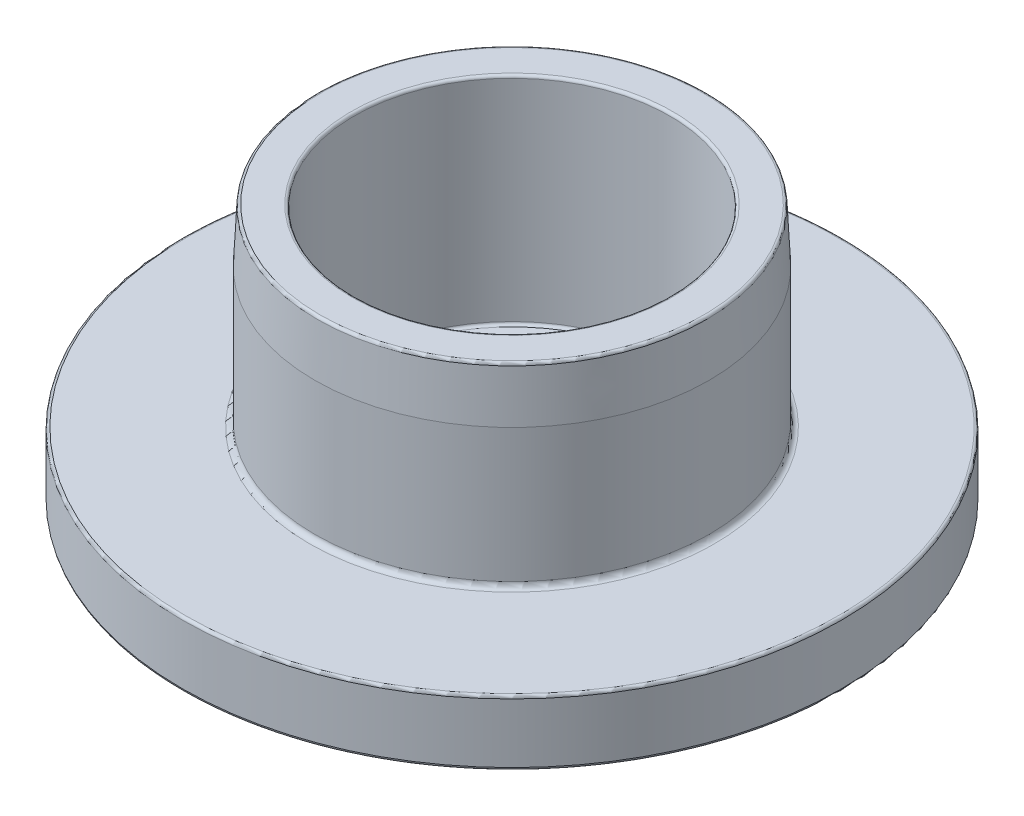
ISO-10303-21;
HEADER;
FILE_DESCRIPTION(('STEP AP214'),'2;1');
FILE_NAME('part.step','',(''),(''),'','','');
FILE_SCHEMA(('AUTOMOTIVE_DESIGN { 1 0 10303 214 1 1 1 1 }'));
ENDSEC;
DATA;
#1=APPLICATION_CONTEXT('core data for automotive mechanical design processes');
#2=APPLICATION_PROTOCOL_DEFINITION('international standard','automotive_design',2000,#1);
#3=PRODUCT_CONTEXT('',#1,'mechanical');
#4=PRODUCT('Part','Part','',(#3));
#5=PRODUCT_RELATED_PRODUCT_CATEGORY('part','',(#4));
#6=PRODUCT_DEFINITION_FORMATION('','',#4);
#7=PRODUCT_DEFINITION_CONTEXT('part definition',#1,'design');
#8=PRODUCT_DEFINITION('design','',#6,#7);
#9=PRODUCT_DEFINITION_SHAPE('','',#8);
#10=(LENGTH_UNIT() NAMED_UNIT(*) SI_UNIT(.MILLI.,.METRE.));
#11=(NAMED_UNIT(*) PLANE_ANGLE_UNIT() SI_UNIT($,.RADIAN.));
#12=(NAMED_UNIT(*) SI_UNIT($,.STERADIAN.) SOLID_ANGLE_UNIT());
#13=UNCERTAINTY_MEASURE_WITH_UNIT(LENGTH_MEASURE(1.E-05),#10,'distance_accuracy_value','');
#14=(GEOMETRIC_REPRESENTATION_CONTEXT(3) GLOBAL_UNCERTAINTY_ASSIGNED_CONTEXT((#13)) GLOBAL_UNIT_ASSIGNED_CONTEXT((#10,
#11,#12)) REPRESENTATION_CONTEXT('',''));
#15=CARTESIAN_POINT('',(0.,0.,0.));
#16=DIRECTION('',(0.,0.,1.));
#17=DIRECTION('',(1.,0.,0.));
#18=AXIS2_PLACEMENT_3D('',#15,#16,#17);
#19=CARTESIAN_POINT('',(0.,-52.5162162162162,0.));
#20=DIRECTION('',(0.,-1.,0.));
#21=DIRECTION('',(0.,0.,-1.));
#22=AXIS2_PLACEMENT_3D('',#19,#20,#21);
#23=CYLINDRICAL_SURFACE('',#22,29.25);
#24=CARTESIAN_POINT('',(0.,10.4228228228228,0.));
#25=DIRECTION('',(0.,1.,0.));
#26=DIRECTION('',(0.,0.,1.));
#27=AXIS2_PLACEMENT_3D('',#24,#25,#26);
#28=CIRCLE('',#27,29.25);
#29=CARTESIAN_POINT('',(0.,10.4228228228228,29.25));
#30=VERTEX_POINT('',#29);
#31=EDGE_CURVE('E61',#30,#30,#28,.F.);
#32=ORIENTED_EDGE('',*,*,#31,.T.);
#33=EDGE_LOOP('',(#32));
#34=FACE_BOUND('',#33,.T.);
#35=CARTESIAN_POINT('',(0.,49.4228228228228,0.));
#36=DIRECTION('',(0.,1.,0.));
#37=DIRECTION('',(0.,0.,1.));
#38=AXIS2_PLACEMENT_3D('',#35,#36,#37);
#39=CIRCLE('',#38,29.25);
#40=CARTESIAN_POINT('',(0.,49.4228228228228,29.25));
#41=VERTEX_POINT('',#40);
#42=EDGE_CURVE('E79',#41,#41,#39,.T.);
#43=ORIENTED_EDGE('',*,*,#42,.T.);
#44=EDGE_LOOP('',(#43));
#45=FACE_BOUND('',#44,.T.);
#46=ADVANCED_FACE('F29',(#34,#45),#23,.F.);
#47=CARTESIAN_POINT('',(29.25,49.9228228228228,0.));
#48=DIRECTION('',(0.,1.,0.));
#49=DIRECTION('',(0.,0.,1.));
#50=AXIS2_PLACEMENT_3D('',#47,#48,#49);
#51=PLANE('',#50);
#52=CARTESIAN_POINT('',(0.,49.9228228228228,0.));
#53=DIRECTION('',(0.,1.,0.));
#54=DIRECTION('',(0.,0.,1.));
#55=AXIS2_PLACEMENT_3D('',#52,#53,#54);
#56=CIRCLE('',#55,29.75);
#57=CARTESIAN_POINT('',(0.,49.9228228228228,29.75));
#58=VERTEX_POINT('',#57);
#59=EDGE_CURVE('E82',#58,#58,#56,.F.);
#60=ORIENTED_EDGE('',*,*,#59,.T.);
#61=EDGE_LOOP('',(#60));
#62=FACE_BOUND('',#61,.T.);
#63=CARTESIAN_POINT('',(0.,49.9228228228228,0.));
#64=DIRECTION('',(0.,1.,0.));
#65=DIRECTION('',(0.,0.,1.));
#66=AXIS2_PLACEMENT_3D('',#63,#64,#65);
#67=CIRCLE('',#66,35.5243753901375);
#68=CARTESIAN_POINT('',(0.,49.9228228228228,35.5243753901375));
#69=VERTEX_POINT('',#68);
#70=EDGE_CURVE('E85',#69,#69,#67,.T.);
#71=ORIENTED_EDGE('',*,*,#70,.T.);
#72=EDGE_LOOP('',(#71));
#73=FACE_BOUND('',#72,.T.);
#74=ADVANCED_FACE('F125',(#62,#73),#51,.T.);
#75=CARTESIAN_POINT('',(0.,39.9228228228228,0.));
#76=DIRECTION('',(0.,-1.,0.));
#77=DIRECTION('',(0.,0.,-1.));
#78=AXIS2_PLACEMENT_3D('',#75,#76,#77);
#79=CONICAL_SURFACE('',#78,36.5,0.0499583957219407);
#80=CARTESIAN_POINT('',(0.,49.4477916312948,0.));
#81=DIRECTION('',(0.,1.,0.));
#82=DIRECTION('',(0.,0.,1.));
#83=AXIS2_PLACEMENT_3D('',#80,#81,#82);
#84=CIRCLE('',#83,36.0237515595764);
#85=CARTESIAN_POINT('',(0.,49.4477916312948,36.0237515595764));
#86=VERTEX_POINT('',#85);
#87=EDGE_CURVE('E76',#86,#86,#84,.F.);
#88=ORIENTED_EDGE('',*,*,#87,.T.);
#89=EDGE_LOOP('',(#88));
#90=FACE_BOUND('',#89,.T.);
#91=CARTESIAN_POINT('',(0.,39.9228228228228,0.));
#92=DIRECTION('',(0.,-1.,0.));
#93=DIRECTION('',(0.,0.,-1.));
#94=AXIS2_PLACEMENT_3D('',#91,#92,#93);
#95=CIRCLE('',#94,36.5);
#96=CARTESIAN_POINT('',(0.,39.9228228228228,-36.5));
#97=VERTEX_POINT('',#96);
#98=EDGE_CURVE('E100',#97,#97,#95,.T.);
#99=ORIENTED_EDGE('',*,*,#98,.F.);
#100=EDGE_LOOP('',(#99));
#101=FACE_BOUND('',#100,.T.);
#102=ADVANCED_FACE('F131',(#90,#101),#79,.T.);
#103=CARTESIAN_POINT('',(0.,-52.5162162162162,0.));
#104=DIRECTION('',(0.,-1.,0.));
#105=DIRECTION('',(0.,0.,-1.));
#106=AXIS2_PLACEMENT_3D('',#103,#104,#105);
#107=CYLINDRICAL_SURFACE('',#106,36.5);
#108=CARTESIAN_POINT('',(0.,15.2228228228228,0.));
#109=DIRECTION('',(0.,1.,0.));
#110=DIRECTION('',(0.,0.,1.));
#111=AXIS2_PLACEMENT_3D('',#108,#109,#110);
#112=CIRCLE('',#111,36.5);
#113=CARTESIAN_POINT('',(0.,15.2228228228228,36.5));
#114=VERTEX_POINT('',#113);
#115=EDGE_CURVE('E70',#114,#114,#112,.T.);
#116=ORIENTED_EDGE('',*,*,#115,.T.);
#117=EDGE_LOOP('',(#116));
#118=FACE_BOUND('',#117,.T.);
#119=ORIENTED_EDGE('',*,*,#98,.T.);
#120=EDGE_LOOP('',(#119));
#121=FACE_BOUND('',#120,.T.);
#122=ADVANCED_FACE('F310',(#118,#121),#107,.T.);
#123=CARTESIAN_POINT('',(36.5,14.2228228228228,0.));
#124=DIRECTION('',(0.,1.,0.));
#125=DIRECTION('',(0.,0.,1.));
#126=AXIS2_PLACEMENT_3D('',#123,#124,#125);
#127=PLANE('',#126);
#128=CARTESIAN_POINT('',(0.,14.2228228228228,0.));
#129=DIRECTION('',(0.,1.,0.));
#130=DIRECTION('',(0.,0.,1.));
#131=AXIS2_PLACEMENT_3D('',#128,#129,#130);
#132=CIRCLE('',#131,37.5);
#133=CARTESIAN_POINT('',(0.,14.2228228228228,37.5));
#134=VERTEX_POINT('',#133);
#135=EDGE_CURVE('E73',#134,#134,#132,.F.);
#136=ORIENTED_EDGE('',*,*,#135,.T.);
#137=EDGE_LOOP('',(#136));
#138=FACE_BOUND('',#137,.T.);
#139=CARTESIAN_POINT('',(0.,14.2228228228228,0.));
#140=DIRECTION('',(0.,1.,0.));
#141=DIRECTION('',(0.,0.,1.));
#142=AXIS2_PLACEMENT_3D('',#139,#140,#141);
#143=CIRCLE('',#142,60.5);
#144=CARTESIAN_POINT('',(0.,14.2228228228228,60.5));
#145=VERTEX_POINT('',#144);
#146=EDGE_CURVE('E88',#145,#145,#143,.T.);
#147=ORIENTED_EDGE('',*,*,#146,.T.);
#148=EDGE_LOOP('',(#147));
#149=FACE_BOUND('',#148,.T.);
#150=ADVANCED_FACE('F303',(#138,#149),#127,.T.);
#151=CARTESIAN_POINT('',(0.,-52.5162162162162,0.));
#152=DIRECTION('',(0.,-1.,0.));
#153=DIRECTION('',(0.,0.,-1.));
#154=AXIS2_PLACEMENT_3D('',#151,#152,#153);
#155=CYLINDRICAL_SURFACE('',#154,61.);
#156=CARTESIAN_POINT('',(0.,2.72282282282282,0.));
#157=DIRECTION('',(0.,-1.,0.));
#158=DIRECTION('',(0.,0.,-1.));
#159=AXIS2_PLACEMENT_3D('',#156,#157,#158);
#160=CIRCLE('',#159,61.);
#161=CARTESIAN_POINT('',(0.,2.72282282282282,-61.));
#162=VERTEX_POINT('',#161);
#163=EDGE_CURVE('E91',#162,#162,#160,.F.);
#164=ORIENTED_EDGE('',*,*,#163,.T.);
#165=EDGE_LOOP('',(#164));
#166=FACE_BOUND('',#165,.T.);
#167=CARTESIAN_POINT('',(0.,13.7228228228228,0.));
#168=DIRECTION('',(0.,1.,0.));
#169=DIRECTION('',(0.,0.,1.));
#170=AXIS2_PLACEMENT_3D('',#167,#168,#169);
#171=CIRCLE('',#170,61.);
#172=CARTESIAN_POINT('',(0.,13.7228228228228,61.));
#173=VERTEX_POINT('',#172);
#174=EDGE_CURVE('E94',#173,#173,#171,.F.);
#175=ORIENTED_EDGE('',*,*,#174,.T.);
#176=EDGE_LOOP('',(#175));
#177=FACE_BOUND('',#176,.T.);
#178=ADVANCED_FACE('F122',(#166,#177),#155,.T.);
#179=CARTESIAN_POINT('',(61.,2.22282282282282,0.));
#180=DIRECTION('',(0.,-1.,0.));
#181=DIRECTION('',(0.,0.,-1.));
#182=AXIS2_PLACEMENT_3D('',#179,#180,#181);
#183=PLANE('',#182);
#184=CARTESIAN_POINT('',(0.,2.22282282282282,0.));
#185=DIRECTION('',(0.,-1.,0.));
#186=DIRECTION('',(0.,0.,-1.));
#187=AXIS2_PLACEMENT_3D('',#184,#185,#186);
#188=CIRCLE('',#187,34.);
#189=CARTESIAN_POINT('',(0.,2.22282282282282,-34.));
#190=VERTEX_POINT('',#189);
#191=EDGE_CURVE('E10',#190,#190,#188,.F.);
#192=ORIENTED_EDGE('',*,*,#191,.T.);
#193=EDGE_LOOP('',(#192));
#194=FACE_BOUND('',#193,.T.);
#195=CARTESIAN_POINT('',(0.,2.22282282282282,0.));
#196=DIRECTION('',(0.,-1.,0.));
#197=DIRECTION('',(0.,0.,-1.));
#198=AXIS2_PLACEMENT_3D('',#195,#196,#197);
#199=CIRCLE('',#198,60.5);
#200=CARTESIAN_POINT('',(0.,2.22282282282282,-60.5));
#201=VERTEX_POINT('',#200);
#202=EDGE_CURVE('E97',#201,#201,#199,.T.);
#203=ORIENTED_EDGE('',*,*,#202,.T.);
#204=EDGE_LOOP('',(#203));
#205=FACE_BOUND('',#204,.T.);
#206=ADVANCED_FACE('F113',(#194,#205),#183,.T.);
#207=CARTESIAN_POINT('',(0.,-52.5162162162162,0.));
#208=DIRECTION('',(0.,-1.,0.));
#209=DIRECTION('',(0.,0.,-1.));
#210=AXIS2_PLACEMENT_3D('',#207,#208,#209);
#211=CYLINDRICAL_SURFACE('',#210,33.);
#212=CARTESIAN_POINT('',(0.,1.22282282282282,0.));
#213=DIRECTION('',(0.,-1.,0.));
#214=DIRECTION('',(0.,0.,-1.));
#215=AXIS2_PLACEMENT_3D('',#212,#213,#214);
#216=CIRCLE('',#215,33.);
#217=CARTESIAN_POINT('',(0.,1.22282282282282,-33.));
#218=VERTEX_POINT('',#217);
#219=EDGE_CURVE('E36',#218,#218,#216,.T.);
#220=ORIENTED_EDGE('',*,*,#219,.T.);
#221=EDGE_LOOP('',(#220));
#222=FACE_BOUND('',#221,.T.);
#223=CARTESIAN_POINT('',(0.,-5.27717717717718,0.));
#224=DIRECTION('',(0.,-1.,0.));
#225=DIRECTION('',(0.,0.,-1.));
#226=AXIS2_PLACEMENT_3D('',#223,#224,#225);
#227=CIRCLE('',#226,33.);
#228=CARTESIAN_POINT('',(0.,-5.27717717717718,-33.));
#229=VERTEX_POINT('',#228);
#230=EDGE_CURVE('E103',#229,#229,#227,.T.);
#231=ORIENTED_EDGE('',*,*,#230,.F.);
#232=EDGE_LOOP('',(#231));
#233=FACE_BOUND('',#232,.T.);
#234=ADVANCED_FACE('F110',(#222,#233),#211,.T.);
#235=CARTESIAN_POINT('',(0.,-17.7771771771772,0.));
#236=DIRECTION('',(0.,1.,0.));
#237=DIRECTION('',(0.,0.,1.));
#238=AXIS2_PLACEMENT_3D('',#235,#236,#237);
#239=CONICAL_SURFACE('',#238,30.75,0.0996686524911615);
#240=CARTESIAN_POINT('',(0.,-17.3269290366876,0.));
#241=DIRECTION('',(0.,-1.,0.));
#242=DIRECTION('',(0.,0.,-1.));
#243=AXIS2_PLACEMENT_3D('',#240,#241,#242);
#244=CIRCLE('',#243,30.7950248140489);
#245=CARTESIAN_POINT('',(0.,-17.3269290366876,-30.7950248140489));
#246=VERTEX_POINT('',#245);
#247=EDGE_CURVE('E40',#246,#246,#244,.F.);
#248=ORIENTED_EDGE('',*,*,#247,.T.);
#249=EDGE_LOOP('',(#248));
#250=FACE_BOUND('',#249,.T.);
#251=CARTESIAN_POINT('',(0.,-6.58360669539551,0.));
#252=DIRECTION('',(0.,1.,0.));
#253=DIRECTION('',(0.,0.,1.));
#254=AXIS2_PLACEMENT_3D('',#251,#252,#253);
#255=CIRCLE('',#254,31.8693570481782);
#256=CARTESIAN_POINT('',(0.,-6.58360669539551,31.8693570481782));
#257=VERTEX_POINT('',#256);
#258=EDGE_CURVE('E55',#257,#257,#255,.F.);
#259=ORIENTED_EDGE('',*,*,#258,.T.);
#260=EDGE_LOOP('',(#259));
#261=FACE_BOUND('',#260,.T.);
#262=ADVANCED_FACE('F112',(#250,#261),#239,.T.);
#263=CARTESIAN_POINT('',(30.75,-17.7771771771772,0.));
#264=DIRECTION('',(0.,-1.,0.));
#265=DIRECTION('',(0.,0.,-1.));
#266=AXIS2_PLACEMENT_3D('',#263,#264,#265);
#267=PLANE('',#266);
#268=CARTESIAN_POINT('',(0.,-17.7771771771772,0.));
#269=DIRECTION('',(0.,-1.,0.));
#270=DIRECTION('',(0.,0.,-1.));
#271=AXIS2_PLACEMENT_3D('',#268,#269,#270);
#272=CIRCLE('',#271,24.);
#273=CARTESIAN_POINT('',(0.,-17.7771771771772,-24.));
#274=VERTEX_POINT('',#273);
#275=EDGE_CURVE('E44',#274,#274,#272,.F.);
#276=ORIENTED_EDGE('',*,*,#275,.T.);
#277=EDGE_LOOP('',(#276));
#278=FACE_BOUND('',#277,.T.);
#279=CARTESIAN_POINT('',(0.,-17.7771771771772,0.));
#280=DIRECTION('',(0.,-1.,0.));
#281=DIRECTION('',(0.,0.,-1.));
#282=AXIS2_PLACEMENT_3D('',#279,#280,#281);
#283=CIRCLE('',#282,30.2975062189439);
#284=CARTESIAN_POINT('',(0.,-17.7771771771772,-30.2975062189439));
#285=VERTEX_POINT('',#284);
#286=EDGE_CURVE('E49',#285,#285,#283,.T.);
#287=ORIENTED_EDGE('',*,*,#286,.T.);
#288=EDGE_LOOP('',(#287));
#289=FACE_BOUND('',#288,.T.);
#290=ADVANCED_FACE('F119',(#278,#289),#267,.T.);
#291=CARTESIAN_POINT('',(0.,-52.5162162162162,0.));
#292=DIRECTION('',(0.,-1.,0.));
#293=DIRECTION('',(0.,0.,-1.));
#294=AXIS2_PLACEMENT_3D('',#291,#292,#293);
#295=CYLINDRICAL_SURFACE('',#294,23.5);
#296=CARTESIAN_POINT('',(0.,-17.2771771771772,0.));
#297=DIRECTION('',(0.,-1.,0.));
#298=DIRECTION('',(0.,0.,-1.));
#299=AXIS2_PLACEMENT_3D('',#296,#297,#298);
#300=CIRCLE('',#299,23.5);
#301=CARTESIAN_POINT('',(0.,-17.2771771771772,-23.5));
#302=VERTEX_POINT('',#301);
#303=EDGE_CURVE('E52',#302,#302,#300,.T.);
#304=ORIENTED_EDGE('',*,*,#303,.T.);
#305=EDGE_LOOP('',(#304));
#306=FACE_BOUND('',#305,.T.);
#307=CARTESIAN_POINT('',(0.,9.34547255363319,0.));
#308=DIRECTION('',(0.,1.,0.));
#309=DIRECTION('',(0.,0.,1.));
#310=AXIS2_PLACEMENT_3D('',#307,#308,#309);
#311=CIRCLE('',#310,23.5);
#312=CARTESIAN_POINT('',(0.,9.34547255363319,23.5));
#313=VERTEX_POINT('',#312);
#314=EDGE_CURVE('E64',#313,#313,#311,.T.);
#315=ORIENTED_EDGE('',*,*,#314,.T.);
#316=EDGE_LOOP('',(#315));
#317=FACE_BOUND('',#316,.T.);
#318=ADVANCED_FACE('F183',(#306,#317),#295,.F.);
#319=CARTESIAN_POINT('',(23.5,9.92282282282281,0.));
#320=DIRECTION('',(0.,1.,0.));
#321=DIRECTION('',(0.,0.,1.));
#322=AXIS2_PLACEMENT_3D('',#319,#320,#321);
#323=PLANE('',#322);
#324=CARTESIAN_POINT('',(0.,9.92282282282281,0.));
#325=DIRECTION('',(0.,1.,0.));
#326=DIRECTION('',(0.,0.,1.));
#327=AXIS2_PLACEMENT_3D('',#324,#325,#326);
#328=CIRCLE('',#327,28.75);
#329=CARTESIAN_POINT('',(0.,9.92282282282281,28.75));
#330=VERTEX_POINT('',#329);
#331=EDGE_CURVE('E58',#330,#330,#328,.T.);
#332=ORIENTED_EDGE('',*,*,#331,.T.);
#333=EDGE_LOOP('',(#332));
#334=FACE_BOUND('',#333,.T.);
#335=CARTESIAN_POINT('',(0.,9.92282282282281,0.));
#336=DIRECTION('',(0.,1.,0.));
#337=DIRECTION('',(0.,0.,1.));
#338=AXIS2_PLACEMENT_3D('',#335,#336,#337);
#339=CIRCLE('',#338,24.5);
#340=CARTESIAN_POINT('',(0.,9.92282282282281,24.5));
#341=VERTEX_POINT('',#340);
#342=EDGE_CURVE('E67',#341,#341,#339,.F.);
#343=ORIENTED_EDGE('',*,*,#342,.T.);
#344=EDGE_LOOP('',(#343));
#345=FACE_BOUND('',#344,.T.);
#346=ADVANCED_FACE('F141',(#334,#345),#323,.T.);
#347=CARTESIAN_POINT('',(0.,2.72282282282282,0.));
#348=DIRECTION('',(0.,-1.,0.));
#349=DIRECTION('',(0.,0.,-1.));
#350=AXIS2_PLACEMENT_3D('',#347,#348,#349);
#351=TOROIDAL_SURFACE('',#350,60.5,0.5);
#352=ORIENTED_EDGE('',*,*,#163,.F.);
#353=EDGE_LOOP('',(#352));
#354=FACE_BOUND('',#353,.T.);
#355=ORIENTED_EDGE('',*,*,#202,.F.);
#356=EDGE_LOOP('',(#355));
#357=FACE_BOUND('',#356,.T.);
#358=ADVANCED_FACE('F137',(#354,#357),#351,.T.);
#359=CARTESIAN_POINT('',(0.,13.7228228228228,0.));
#360=DIRECTION('',(0.,1.,0.));
#361=DIRECTION('',(0.,0.,1.));
#362=AXIS2_PLACEMENT_3D('',#359,#360,#361);
#363=TOROIDAL_SURFACE('',#362,60.5,0.5);
#364=ORIENTED_EDGE('',*,*,#146,.F.);
#365=EDGE_LOOP('',(#364));
#366=FACE_BOUND('',#365,.T.);
#367=ORIENTED_EDGE('',*,*,#174,.F.);
#368=EDGE_LOOP('',(#367));
#369=FACE_BOUND('',#368,.T.);
#370=ADVANCED_FACE('F140',(#366,#369),#363,.T.);
#371=CARTESIAN_POINT('',(0.,49.4228228228228,0.));
#372=DIRECTION('',(0.,1.,0.));
#373=DIRECTION('',(0.,0.,1.));
#374=AXIS2_PLACEMENT_3D('',#371,#372,#373);
#375=TOROIDAL_SURFACE('',#374,29.75,0.5);
#376=ORIENTED_EDGE('',*,*,#42,.F.);
#377=EDGE_LOOP('',(#376));
#378=FACE_BOUND('',#377,.T.);
#379=ORIENTED_EDGE('',*,*,#59,.F.);
#380=EDGE_LOOP('',(#379));
#381=FACE_BOUND('',#380,.T.);
#382=ADVANCED_FACE('F145',(#378,#381),#375,.T.);
#383=CARTESIAN_POINT('',(0.,49.4228228228228,0.));
#384=DIRECTION('',(0.,1.,0.));
#385=DIRECTION('',(0.,0.,1.));
#386=AXIS2_PLACEMENT_3D('',#383,#384,#385);
#387=TOROIDAL_SURFACE('',#386,35.5243753901375,0.5);
#388=ORIENTED_EDGE('',*,*,#70,.F.);
#389=EDGE_LOOP('',(#388));
#390=FACE_BOUND('',#389,.T.);
#391=ORIENTED_EDGE('',*,*,#87,.F.);
#392=EDGE_LOOP('',(#391));
#393=FACE_BOUND('',#392,.T.);
#394=ADVANCED_FACE('F149',(#390,#393),#387,.T.);
#395=CARTESIAN_POINT('',(0.,15.2228228228228,0.));
#396=DIRECTION('',(0.,1.,0.));
#397=DIRECTION('',(0.,0.,1.));
#398=AXIS2_PLACEMENT_3D('',#395,#396,#397);
#399=TOROIDAL_SURFACE('',#398,37.5,1.);
#400=ORIENTED_EDGE('',*,*,#115,.F.);
#401=EDGE_LOOP('',(#400));
#402=FACE_BOUND('',#401,.T.);
#403=ORIENTED_EDGE('',*,*,#135,.F.);
#404=EDGE_LOOP('',(#403));
#405=FACE_BOUND('',#404,.T.);
#406=ADVANCED_FACE('F153',(#402,#405),#399,.F.);
#407=CARTESIAN_POINT('',(0.,9.92282282282281,0.));
#408=DIRECTION('',(0.,1.,0.));
#409=DIRECTION('',(0.,0.,1.));
#410=AXIS2_PLACEMENT_3D('',#407,#408,#409);
#411=CONICAL_SURFACE('',#410,24.5,1.0471975511966);
#412=ORIENTED_EDGE('',*,*,#314,.F.);
#413=EDGE_LOOP('',(#412));
#414=FACE_BOUND('',#413,.T.);
#415=ORIENTED_EDGE('',*,*,#342,.F.);
#416=EDGE_LOOP('',(#415));
#417=FACE_BOUND('',#416,.T.);
#418=ADVANCED_FACE('F157',(#414,#417),#411,.F.);
#419=CARTESIAN_POINT('',(0.,10.4228228228228,0.));
#420=DIRECTION('',(0.,1.,0.));
#421=DIRECTION('',(0.,0.,1.));
#422=AXIS2_PLACEMENT_3D('',#419,#420,#421);
#423=TOROIDAL_SURFACE('',#422,28.75,0.5);
#424=ORIENTED_EDGE('',*,*,#331,.F.);
#425=EDGE_LOOP('',(#424));
#426=FACE_BOUND('',#425,.T.);
#427=ORIENTED_EDGE('',*,*,#31,.F.);
#428=EDGE_LOOP('',(#427));
#429=FACE_BOUND('',#428,.T.);
#430=ADVANCED_FACE('F161',(#426,#429),#423,.F.);
#431=CARTESIAN_POINT('',(0.,-6.73286227392701,0.));
#432=DIRECTION('',(0.,1.,0.));
#433=DIRECTION('',(0.,0.,1.));
#434=AXIS2_PLACEMENT_3D('',#431,#432,#433);
#435=TOROIDAL_SURFACE('',#434,33.3619128334931,1.5);
#436=ORIENTED_EDGE('',*,*,#230,.T.);
#437=EDGE_LOOP('',(#436));
#438=FACE_BOUND('',#437,.T.);
#439=ORIENTED_EDGE('',*,*,#258,.F.);
#440=EDGE_LOOP('',(#439));
#441=FACE_BOUND('',#440,.T.);
#442=ADVANCED_FACE('F107',(#438,#441),#435,.F.);
#443=CARTESIAN_POINT('',(0.,-17.2771771771772,0.));
#444=DIRECTION('',(0.,-1.,0.));
#445=DIRECTION('',(0.,0.,-1.));
#446=AXIS2_PLACEMENT_3D('',#443,#444,#445);
#447=TOROIDAL_SURFACE('',#446,24.,0.5);
#448=ORIENTED_EDGE('',*,*,#275,.F.);
#449=EDGE_LOOP('',(#448));
#450=FACE_BOUND('',#449,.T.);
#451=ORIENTED_EDGE('',*,*,#303,.F.);
#452=EDGE_LOOP('',(#451));
#453=FACE_BOUND('',#452,.T.);
#454=ADVANCED_FACE('F168',(#450,#453),#447,.T.);
#455=CARTESIAN_POINT('',(0.,-17.2771771771772,0.));
#456=DIRECTION('',(0.,-1.,0.));
#457=DIRECTION('',(0.,0.,-1.));
#458=AXIS2_PLACEMENT_3D('',#455,#456,#457);
#459=TOROIDAL_SURFACE('',#458,30.2975062189439,0.5);
#460=ORIENTED_EDGE('',*,*,#247,.F.);
#461=EDGE_LOOP('',(#460));
#462=FACE_BOUND('',#461,.T.);
#463=ORIENTED_EDGE('',*,*,#286,.F.);
#464=EDGE_LOOP('',(#463));
#465=FACE_BOUND('',#464,.T.);
#466=ADVANCED_FACE('F170',(#462,#465),#459,.T.);
#467=CARTESIAN_POINT('',(0.,1.22282282282282,0.));
#468=DIRECTION('',(0.,-1.,0.));
#469=DIRECTION('',(0.,0.,-1.));
#470=AXIS2_PLACEMENT_3D('',#467,#468,#469);
#471=TOROIDAL_SURFACE('',#470,34.,1.);
#472=ORIENTED_EDGE('',*,*,#191,.F.);
#473=EDGE_LOOP('',(#472));
#474=FACE_BOUND('',#473,.T.);
#475=ORIENTED_EDGE('',*,*,#219,.F.);
#476=EDGE_LOOP('',(#475));
#477=FACE_BOUND('',#476,.T.);
#478=ADVANCED_FACE('F31',(#474,#477),#471,.F.);
#479=CLOSED_SHELL('',(#46,#74,#102,#122,#150,#178,#206,#234,#262,#290,#318,#346,#358,#370,#382,
#394,#406,#418,#430,#442,#454,#466,#478));
#480=MANIFOLD_SOLID_BREP('B2',#479);
#481=ADVANCED_BREP_SHAPE_REPRESENTATION('',(#18,#480),#14);
#482=SHAPE_DEFINITION_REPRESENTATION(#9,#481);
ENDSEC;
END-ISO-10303-21;
